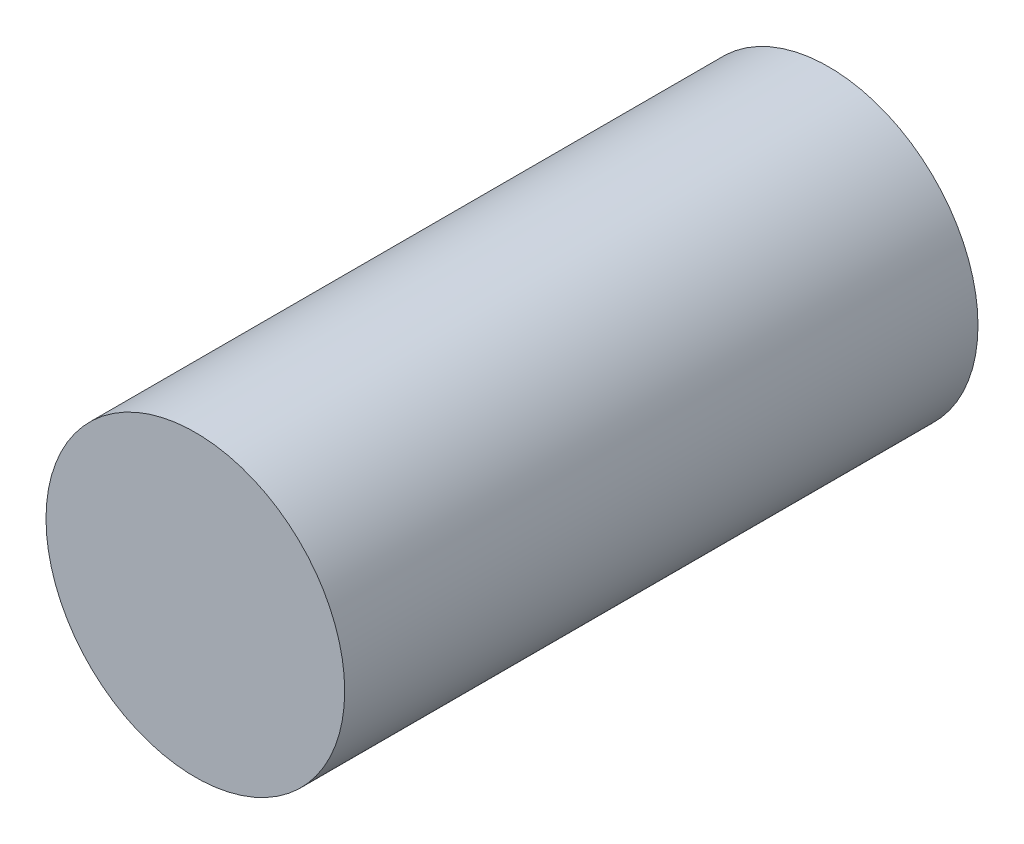
ISO-10303-21;
HEADER;
FILE_DESCRIPTION(('STEP AP214'),'2;1');
FILE_NAME('part.step','',(''),(''),'','','');
FILE_SCHEMA(('AUTOMOTIVE_DESIGN { 1 0 10303 214 1 1 1 1 }'));
ENDSEC;
DATA;
#1=APPLICATION_CONTEXT('core data for automotive mechanical design processes');
#2=APPLICATION_PROTOCOL_DEFINITION('international standard','automotive_design',2000,#1);
#3=PRODUCT_CONTEXT('',#1,'mechanical');
#4=PRODUCT('Part','Part','',(#3));
#5=PRODUCT_RELATED_PRODUCT_CATEGORY('part','',(#4));
#6=PRODUCT_DEFINITION_FORMATION('','',#4);
#7=PRODUCT_DEFINITION_CONTEXT('part definition',#1,'design');
#8=PRODUCT_DEFINITION('design','',#6,#7);
#9=PRODUCT_DEFINITION_SHAPE('','',#8);
#10=(LENGTH_UNIT() NAMED_UNIT(*) SI_UNIT(.MILLI.,.METRE.));
#11=(NAMED_UNIT(*) PLANE_ANGLE_UNIT() SI_UNIT($,.RADIAN.));
#12=(NAMED_UNIT(*) SI_UNIT($,.STERADIAN.) SOLID_ANGLE_UNIT());
#13=UNCERTAINTY_MEASURE_WITH_UNIT(LENGTH_MEASURE(1.E-05),#10,'distance_accuracy_value','');
#14=(GEOMETRIC_REPRESENTATION_CONTEXT(3) GLOBAL_UNCERTAINTY_ASSIGNED_CONTEXT((#13)) GLOBAL_UNIT_ASSIGNED_CONTEXT((#10,
#11,#12)) REPRESENTATION_CONTEXT('',''));
#15=CARTESIAN_POINT('',(0.,0.,0.));
#16=DIRECTION('',(0.,0.,1.));
#17=DIRECTION('',(1.,0.,0.));
#18=AXIS2_PLACEMENT_3D('',#15,#16,#17);
#19=CARTESIAN_POINT('',(0.,0.,7.539999906));
#20=DIRECTION('',(0.,0.,-1.));
#21=DIRECTION('',(-1.,0.,0.));
#22=AXIS2_PLACEMENT_3D('',#19,#20,#21);
#23=CYLINDRICAL_SURFACE('',#22,1.778);
#24=CARTESIAN_POINT('',(0.,0.,7.539999906));
#25=DIRECTION('',(0.,0.,1.));
#26=DIRECTION('',(1.,0.,0.));
#27=AXIS2_PLACEMENT_3D('',#24,#25,#26);
#28=CIRCLE('',#27,1.778);
#29=CARTESIAN_POINT('',(1.778,0.,7.539999906));
#30=VERTEX_POINT('',#29);
#31=EDGE_CURVE('E10',#30,#30,#28,.T.);
#32=ORIENTED_EDGE('',*,*,#31,.F.);
#33=EDGE_LOOP('',(#32));
#34=FACE_BOUND('',#33,.T.);
#35=CARTESIAN_POINT('',(0.,0.,0.));
#36=DIRECTION('',(0.,0.,1.));
#37=DIRECTION('',(1.,0.,0.));
#38=AXIS2_PLACEMENT_3D('',#35,#36,#37);
#39=CIRCLE('',#38,1.778);
#40=CARTESIAN_POINT('',(1.778,0.,0.));
#41=VERTEX_POINT('',#40);
#42=EDGE_CURVE('E46',#41,#41,#39,.T.);
#43=ORIENTED_EDGE('',*,*,#42,.T.);
#44=EDGE_LOOP('',(#43));
#45=FACE_BOUND('',#44,.T.);
#46=ADVANCED_FACE('F43',(#34,#45),#23,.T.);
#47=CARTESIAN_POINT('',(0.,0.,7.539999906));
#48=DIRECTION('',(0.,0.,1.));
#49=DIRECTION('',(1.,0.,0.));
#50=AXIS2_PLACEMENT_3D('',#47,#48,#49);
#51=PLANE('',#50);
#52=ORIENTED_EDGE('',*,*,#31,.T.);
#53=EDGE_LOOP('',(#52));
#54=FACE_BOUND('',#53,.T.);
#55=ADVANCED_FACE('F60',(#54),#51,.T.);
#56=CARTESIAN_POINT('',(0.,0.,0.));
#57=DIRECTION('',(0.,0.,1.));
#58=DIRECTION('',(1.,0.,0.));
#59=AXIS2_PLACEMENT_3D('',#56,#57,#58);
#60=PLANE('',#59);
#61=ORIENTED_EDGE('',*,*,#42,.F.);
#62=EDGE_LOOP('',(#61));
#63=FACE_BOUND('',#62,.T.);
#64=ADVANCED_FACE('F58',(#63),#60,.F.);
#65=CLOSED_SHELL('',(#46,#55,#64));
#66=MANIFOLD_SOLID_BREP('B2',#65);
#67=ADVANCED_BREP_SHAPE_REPRESENTATION('',(#18,#66),#14);
#68=SHAPE_DEFINITION_REPRESENTATION(#9,#67);
ENDSEC;
END-ISO-10303-21;
